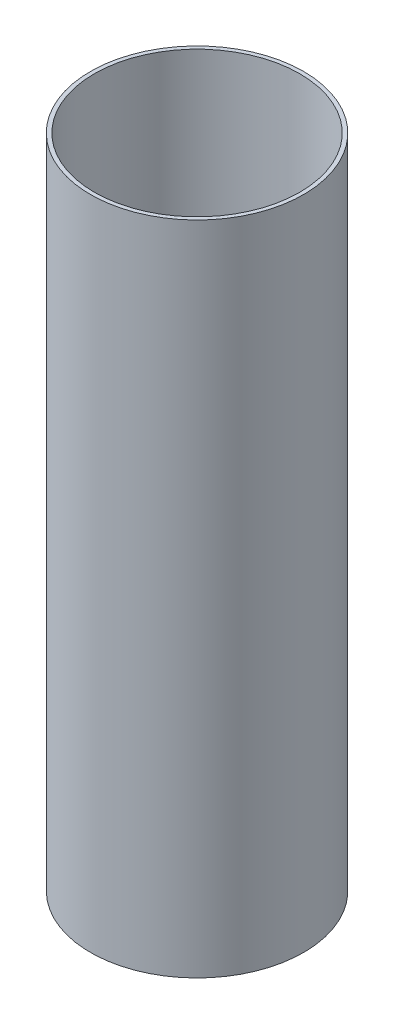
ISO-10303-21;
HEADER;
FILE_DESCRIPTION(('STEP AP214'),'2;1');
FILE_NAME('part.step','',(''),(''),'','','');
FILE_SCHEMA(('AUTOMOTIVE_DESIGN { 1 0 10303 214 1 1 1 1 }'));
ENDSEC;
DATA;
#1=APPLICATION_CONTEXT('core data for automotive mechanical design processes');
#2=APPLICATION_PROTOCOL_DEFINITION('international standard','automotive_design',2000,#1);
#3=PRODUCT_CONTEXT('',#1,'mechanical');
#4=PRODUCT('Part','Part','',(#3));
#5=PRODUCT_RELATED_PRODUCT_CATEGORY('part','',(#4));
#6=PRODUCT_DEFINITION_FORMATION('','',#4);
#7=PRODUCT_DEFINITION_CONTEXT('part definition',#1,'design');
#8=PRODUCT_DEFINITION('design','',#6,#7);
#9=PRODUCT_DEFINITION_SHAPE('','',#8);
#10=(LENGTH_UNIT() NAMED_UNIT(*) SI_UNIT(.MILLI.,.METRE.));
#11=(NAMED_UNIT(*) PLANE_ANGLE_UNIT() SI_UNIT($,.RADIAN.));
#12=(NAMED_UNIT(*) SI_UNIT($,.STERADIAN.) SOLID_ANGLE_UNIT());
#13=UNCERTAINTY_MEASURE_WITH_UNIT(LENGTH_MEASURE(1.E-05),#10,'distance_accuracy_value','');
#14=(GEOMETRIC_REPRESENTATION_CONTEXT(3) GLOBAL_UNCERTAINTY_ASSIGNED_CONTEXT((#13)) GLOBAL_UNIT_ASSIGNED_CONTEXT((#10,
#11,#12)) REPRESENTATION_CONTEXT('',''));
#15=CARTESIAN_POINT('',(0.,0.,0.));
#16=DIRECTION('',(0.,0.,1.));
#17=DIRECTION('',(1.,0.,0.));
#18=AXIS2_PLACEMENT_3D('',#15,#16,#17);
#19=CARTESIAN_POINT('',(0.,304.8,0.));
#20=DIRECTION('',(0.,1.,0.));
#21=DIRECTION('',(0.,0.,1.));
#22=AXIS2_PLACEMENT_3D('',#19,#20,#21);
#23=PLANE('',#22);
#24=CARTESIAN_POINT('',(0.,304.8,0.));
#25=DIRECTION('',(0.,1.,0.));
#26=DIRECTION('',(0.,0.,1.));
#27=AXIS2_PLACEMENT_3D('',#24,#25,#26);
#28=CIRCLE('',#27,49.5046);
#29=CARTESIAN_POINT('',(0.,304.8,-49.5046));
#30=VERTEX_POINT('',#29);
#31=EDGE_CURVE('E10',#30,#30,#28,.T.);
#32=ORIENTED_EDGE('',*,*,#31,.T.);
#33=EDGE_LOOP('',(#32));
#34=FACE_BOUND('',#33,.T.);
#35=CARTESIAN_POINT('',(0.,304.8,0.));
#36=DIRECTION('',(0.,1.,0.));
#37=DIRECTION('',(0.,0.,1.));
#38=AXIS2_PLACEMENT_3D('',#35,#36,#37);
#39=CIRCLE('',#38,47.6885);
#40=CARTESIAN_POINT('',(0.,304.8,-47.6885));
#41=VERTEX_POINT('',#40);
#42=EDGE_CURVE('E57',#41,#41,#39,.T.);
#43=ORIENTED_EDGE('',*,*,#42,.F.);
#44=EDGE_LOOP('',(#43));
#45=FACE_BOUND('',#44,.T.);
#46=ADVANCED_FACE('F43',(#34,#45),#23,.T.);
#47=CARTESIAN_POINT('',(0.,0.,0.));
#48=DIRECTION('',(0.,1.,0.));
#49=DIRECTION('',(0.,0.,1.));
#50=AXIS2_PLACEMENT_3D('',#47,#48,#49);
#51=PLANE('',#50);
#52=CARTESIAN_POINT('',(0.,0.,0.));
#53=DIRECTION('',(0.,1.,0.));
#54=DIRECTION('',(0.,0.,1.));
#55=AXIS2_PLACEMENT_3D('',#52,#53,#54);
#56=CIRCLE('',#55,49.5046);
#57=CARTESIAN_POINT('',(0.,0.,-49.5046));
#58=VERTEX_POINT('',#57);
#59=EDGE_CURVE('E50',#58,#58,#56,.T.);
#60=ORIENTED_EDGE('',*,*,#59,.F.);
#61=EDGE_LOOP('',(#60));
#62=FACE_BOUND('',#61,.T.);
#63=CARTESIAN_POINT('',(0.,0.,0.));
#64=DIRECTION('',(0.,1.,0.));
#65=DIRECTION('',(0.,0.,1.));
#66=AXIS2_PLACEMENT_3D('',#63,#64,#65);
#67=CIRCLE('',#66,47.6885);
#68=CARTESIAN_POINT('',(0.,0.,-47.6885));
#69=VERTEX_POINT('',#68);
#70=EDGE_CURVE('E59',#69,#69,#67,.T.);
#71=ORIENTED_EDGE('',*,*,#70,.T.);
#72=EDGE_LOOP('',(#71));
#73=FACE_BOUND('',#72,.T.);
#74=ADVANCED_FACE('F66',(#62,#73),#51,.F.);
#75=CARTESIAN_POINT('',(0.,304.8,0.));
#76=DIRECTION('',(0.,-1.,0.));
#77=DIRECTION('',(0.,0.,-1.));
#78=AXIS2_PLACEMENT_3D('',#75,#76,#77);
#79=CYLINDRICAL_SURFACE('',#78,49.5046);
#80=CARTESIAN_POINT('',(0.,304.8,-49.5046));
#81=CARTESIAN_POINT('',(0.,301.625,-49.5046));
#82=CARTESIAN_POINT('',(0.,298.45,-49.5046));
#83=CARTESIAN_POINT('',(0.,292.1,-49.5046));
#84=CARTESIAN_POINT('',(0.,288.925,-49.5046));
#85=CARTESIAN_POINT('',(0.,282.575,-49.5046));
#86=CARTESIAN_POINT('',(0.,279.4,-49.5046));
#87=CARTESIAN_POINT('',(0.,273.05,-49.5046));
#88=CARTESIAN_POINT('',(0.,269.875,-49.5046));
#89=CARTESIAN_POINT('',(0.,263.525,-49.5046));
#90=CARTESIAN_POINT('',(0.,260.35,-49.5046));
#91=CARTESIAN_POINT('',(0.,254.,-49.5046));
#92=CARTESIAN_POINT('',(0.,250.825,-49.5046));
#93=CARTESIAN_POINT('',(0.,244.475,-49.5046));
#94=CARTESIAN_POINT('',(0.,241.3,-49.5046));
#95=CARTESIAN_POINT('',(0.,234.95,-49.5046));
#96=CARTESIAN_POINT('',(0.,231.775,-49.5046));
#97=CARTESIAN_POINT('',(0.,225.425,-49.5046));
#98=CARTESIAN_POINT('',(0.,222.25,-49.5046));
#99=CARTESIAN_POINT('',(0.,215.9,-49.5046));
#100=CARTESIAN_POINT('',(0.,212.725,-49.5046));
#101=CARTESIAN_POINT('',(0.,206.375,-49.5046));
#102=CARTESIAN_POINT('',(0.,203.2,-49.5046));
#103=CARTESIAN_POINT('',(0.,196.85,-49.5046));
#104=CARTESIAN_POINT('',(0.,193.675,-49.5046));
#105=CARTESIAN_POINT('',(0.,187.325,-49.5046));
#106=CARTESIAN_POINT('',(0.,184.15,-49.5046));
#107=CARTESIAN_POINT('',(0.,177.8,-49.5046));
#108=CARTESIAN_POINT('',(0.,174.625,-49.5046));
#109=CARTESIAN_POINT('',(0.,168.275,-49.5046));
#110=CARTESIAN_POINT('',(0.,165.1,-49.5046));
#111=CARTESIAN_POINT('',(0.,158.75,-49.5046));
#112=CARTESIAN_POINT('',(0.,155.575,-49.5046));
#113=CARTESIAN_POINT('',(0.,149.225,-49.5046));
#114=CARTESIAN_POINT('',(0.,146.05,-49.5046));
#115=CARTESIAN_POINT('',(0.,139.7,-49.5046));
#116=CARTESIAN_POINT('',(0.,136.525,-49.5046));
#117=CARTESIAN_POINT('',(0.,130.175,-49.5046));
#118=CARTESIAN_POINT('',(0.,127.,-49.5046));
#119=CARTESIAN_POINT('',(0.,120.65,-49.5046));
#120=CARTESIAN_POINT('',(0.,117.475,-49.5046));
#121=CARTESIAN_POINT('',(0.,111.125,-49.5046));
#122=CARTESIAN_POINT('',(0.,107.95,-49.5046));
#123=CARTESIAN_POINT('',(0.,101.6,-49.5046));
#124=CARTESIAN_POINT('',(0.,98.425,-49.5046));
#125=CARTESIAN_POINT('',(0.,92.075,-49.5046));
#126=CARTESIAN_POINT('',(0.,88.9,-49.5046));
#127=CARTESIAN_POINT('',(0.,82.55,-49.5046));
#128=CARTESIAN_POINT('',(0.,79.375,-49.5046));
#129=CARTESIAN_POINT('',(0.,73.025,-49.5046));
#130=CARTESIAN_POINT('',(0.,69.85,-49.5046));
#131=CARTESIAN_POINT('',(0.,63.5,-49.5046));
#132=CARTESIAN_POINT('',(0.,60.325,-49.5046));
#133=CARTESIAN_POINT('',(0.,53.975,-49.5046));
#134=CARTESIAN_POINT('',(0.,50.8,-49.5046));
#135=CARTESIAN_POINT('',(0.,44.45,-49.5046));
#136=CARTESIAN_POINT('',(0.,41.275,-49.5046));
#137=CARTESIAN_POINT('',(0.,34.925,-49.5046));
#138=CARTESIAN_POINT('',(0.,31.75,-49.5046));
#139=CARTESIAN_POINT('',(0.,25.4,-49.5046));
#140=CARTESIAN_POINT('',(0.,22.225,-49.5046));
#141=CARTESIAN_POINT('',(0.,15.875,-49.5046));
#142=CARTESIAN_POINT('',(0.,12.7,-49.5046));
#143=CARTESIAN_POINT('',(0.,6.35,-49.5046));
#144=CARTESIAN_POINT('',(0.,3.175,-49.5046));
#145=CARTESIAN_POINT('',(0.,0.,-49.5046));
#146=B_SPLINE_CURVE_WITH_KNOTS('',3,(#80,#81,#82,#83,#84,#85,#86,#87,#88,#89,#90,#91,#92,#93,
#94,#95,#96,#97,#98,#99,#100,#101,#102,#103,#104,#105,#106,#107,#108,#109,#110,#111,#112,#113,
#114,#115,#116,#117,#118,#119,#120,#121,#122,#123,#124,#125,#126,#127,#128,#129,#130,#131,#132,
#133,#134,#135,#136,#137,#138,#139,#140,#141,#142,#143,#144,#145),.UNSPECIFIED.,.F.,.F.,(4,2,2,
2,2,2,2,2,2,2,2,2,2,2,2,2,2,2,2,2,2,2,2,2,2,2,2,2,2,2,2,2,4),(0.,9.52500000000001,19.05,28.575,
38.1,47.625,57.15,66.675,76.2,85.7250000000001,95.2500000000001,104.775,114.3,123.825,133.35,
142.875,152.4,161.925,171.45,180.975,190.5,200.025,209.55,219.075,228.6,238.125,247.65,257.175,
266.7,276.225,285.75,295.275,304.8),.UNSPECIFIED.);
#147=EDGE_CURVE('BSEAM44',#30,#58,#146,.T.);
#148=ORIENTED_EDGE('',*,*,#31,.F.);
#149=ORIENTED_EDGE('',*,*,#59,.T.);
#150=ORIENTED_EDGE('',*,*,#147,.T.);
#151=ORIENTED_EDGE('',*,*,#147,.F.);
#152=EDGE_LOOP('',(#148,#150,#149,#151));
#153=FACE_BOUND('',#152,.T.);
#154=ADVANCED_FACE('F44',(#153),#79,.T.);
#155=CARTESIAN_POINT('',(0.,304.8,0.));
#156=DIRECTION('',(0.,-1.,0.));
#157=DIRECTION('',(0.,0.,-1.));
#158=AXIS2_PLACEMENT_3D('',#155,#156,#157);
#159=CYLINDRICAL_SURFACE('',#158,47.6885);
#160=CARTESIAN_POINT('',(0.,304.8,-47.6885));
#161=CARTESIAN_POINT('',(0.,301.625,-47.6885));
#162=CARTESIAN_POINT('',(0.,298.45,-47.6885));
#163=CARTESIAN_POINT('',(0.,292.1,-47.6885));
#164=CARTESIAN_POINT('',(0.,288.925,-47.6885));
#165=CARTESIAN_POINT('',(0.,282.575,-47.6885));
#166=CARTESIAN_POINT('',(0.,279.4,-47.6885));
#167=CARTESIAN_POINT('',(0.,273.05,-47.6885));
#168=CARTESIAN_POINT('',(0.,269.875,-47.6885));
#169=CARTESIAN_POINT('',(0.,263.525,-47.6885));
#170=CARTESIAN_POINT('',(0.,260.35,-47.6885));
#171=CARTESIAN_POINT('',(0.,254.,-47.6885));
#172=CARTESIAN_POINT('',(0.,250.825,-47.6885));
#173=CARTESIAN_POINT('',(0.,244.475,-47.6885));
#174=CARTESIAN_POINT('',(0.,241.3,-47.6885));
#175=CARTESIAN_POINT('',(0.,234.95,-47.6885));
#176=CARTESIAN_POINT('',(0.,231.775,-47.6885));
#177=CARTESIAN_POINT('',(0.,225.425,-47.6885));
#178=CARTESIAN_POINT('',(0.,222.25,-47.6885));
#179=CARTESIAN_POINT('',(0.,215.9,-47.6885));
#180=CARTESIAN_POINT('',(0.,212.725,-47.6885));
#181=CARTESIAN_POINT('',(0.,206.375,-47.6885));
#182=CARTESIAN_POINT('',(0.,203.2,-47.6885));
#183=CARTESIAN_POINT('',(0.,196.85,-47.6885));
#184=CARTESIAN_POINT('',(0.,193.675,-47.6885));
#185=CARTESIAN_POINT('',(0.,187.325,-47.6885));
#186=CARTESIAN_POINT('',(0.,184.15,-47.6885));
#187=CARTESIAN_POINT('',(0.,177.8,-47.6885));
#188=CARTESIAN_POINT('',(0.,174.625,-47.6885));
#189=CARTESIAN_POINT('',(0.,168.275,-47.6885));
#190=CARTESIAN_POINT('',(0.,165.1,-47.6885));
#191=CARTESIAN_POINT('',(0.,158.75,-47.6885));
#192=CARTESIAN_POINT('',(0.,155.575,-47.6885));
#193=CARTESIAN_POINT('',(0.,149.225,-47.6885));
#194=CARTESIAN_POINT('',(0.,146.05,-47.6885));
#195=CARTESIAN_POINT('',(0.,139.7,-47.6885));
#196=CARTESIAN_POINT('',(0.,136.525,-47.6885));
#197=CARTESIAN_POINT('',(0.,130.175,-47.6885));
#198=CARTESIAN_POINT('',(0.,127.,-47.6885));
#199=CARTESIAN_POINT('',(0.,120.65,-47.6885));
#200=CARTESIAN_POINT('',(0.,117.475,-47.6885));
#201=CARTESIAN_POINT('',(0.,111.125,-47.6885));
#202=CARTESIAN_POINT('',(0.,107.95,-47.6885));
#203=CARTESIAN_POINT('',(0.,101.6,-47.6885));
#204=CARTESIAN_POINT('',(0.,98.425,-47.6885));
#205=CARTESIAN_POINT('',(0.,92.075,-47.6885));
#206=CARTESIAN_POINT('',(0.,88.9,-47.6885));
#207=CARTESIAN_POINT('',(0.,82.55,-47.6885));
#208=CARTESIAN_POINT('',(0.,79.375,-47.6885));
#209=CARTESIAN_POINT('',(0.,73.025,-47.6885));
#210=CARTESIAN_POINT('',(0.,69.85,-47.6885));
#211=CARTESIAN_POINT('',(0.,63.5,-47.6885));
#212=CARTESIAN_POINT('',(0.,60.325,-47.6885));
#213=CARTESIAN_POINT('',(0.,53.975,-47.6885));
#214=CARTESIAN_POINT('',(0.,50.8,-47.6885));
#215=CARTESIAN_POINT('',(0.,44.45,-47.6885));
#216=CARTESIAN_POINT('',(0.,41.275,-47.6885));
#217=CARTESIAN_POINT('',(0.,34.925,-47.6885));
#218=CARTESIAN_POINT('',(0.,31.75,-47.6885));
#219=CARTESIAN_POINT('',(0.,25.4,-47.6885));
#220=CARTESIAN_POINT('',(0.,22.225,-47.6885));
#221=CARTESIAN_POINT('',(0.,15.875,-47.6885));
#222=CARTESIAN_POINT('',(0.,12.7,-47.6885));
#223=CARTESIAN_POINT('',(0.,6.35,-47.6885));
#224=CARTESIAN_POINT('',(0.,3.175,-47.6885));
#225=CARTESIAN_POINT('',(0.,0.,-47.6885));
#226=B_SPLINE_CURVE_WITH_KNOTS('',3,(#160,#161,#162,#163,#164,#165,#166,#167,#168,#169,#170,
#171,#172,#173,#174,#175,#176,#177,#178,#179,#180,#181,#182,#183,#184,#185,#186,#187,#188,#189,
#190,#191,#192,#193,#194,#195,#196,#197,#198,#199,#200,#201,#202,#203,#204,#205,#206,#207,#208,
#209,#210,#211,#212,#213,#214,#215,#216,#217,#218,#219,#220,#221,#222,#223,#224,#225),
.UNSPECIFIED.,.F.,.F.,(4,2,2,2,2,2,2,2,2,2,2,2,2,2,2,2,2,2,2,2,2,2,2,2,2,2,2,2,2,2,2,2,4),(0.,
9.52500000000001,19.05,28.575,38.1,47.625,57.15,66.675,76.2,85.7250000000001,95.2500000000001,
104.775,114.3,123.825,133.35,142.875,152.4,161.925,171.45,180.975,190.5,200.025,209.55,219.075,
228.6,238.125,247.65,257.175,266.7,276.225,285.75,295.275,304.8),.UNSPECIFIED.);
#227=EDGE_CURVE('BSEAM68',#41,#69,#226,.T.);
#228=ORIENTED_EDGE('',*,*,#42,.T.);
#229=ORIENTED_EDGE('',*,*,#70,.F.);
#230=ORIENTED_EDGE('',*,*,#227,.T.);
#231=ORIENTED_EDGE('',*,*,#227,.F.);
#232=EDGE_LOOP('',(#228,#230,#229,#231));
#233=FACE_BOUND('',#232,.T.);
#234=ADVANCED_FACE('F68',(#233),#159,.F.);
#235=CLOSED_SHELL('',(#46,#74,#154,#234));
#236=MANIFOLD_SOLID_BREP('B2',#235);
#237=ADVANCED_BREP_SHAPE_REPRESENTATION('',(#18,#236),#14);
#238=SHAPE_DEFINITION_REPRESENTATION(#9,#237);
ENDSEC;
END-ISO-10303-21;
